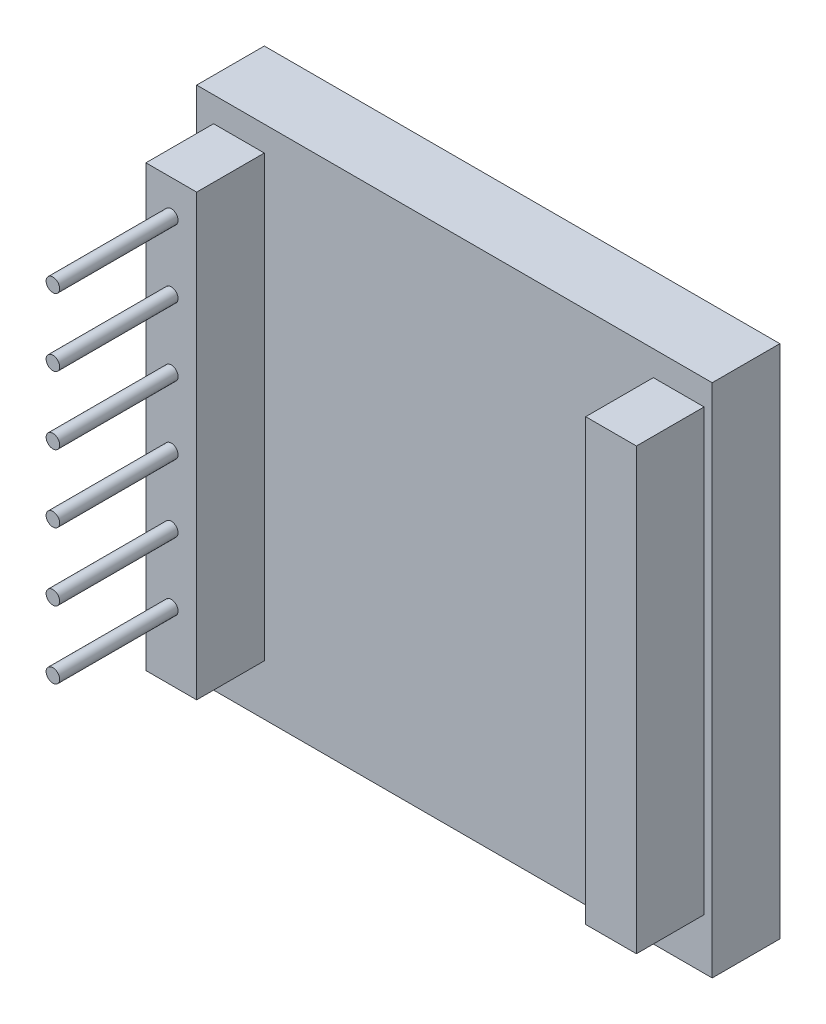
ISO-10303-21;
HEADER;
FILE_DESCRIPTION(('STEP AP214'),'2;1');
FILE_NAME('part.step','',(''),(''),'','','');
FILE_SCHEMA(('AUTOMOTIVE_DESIGN { 1 0 10303 214 1 1 1 1 }'));
ENDSEC;
DATA;
#1=APPLICATION_CONTEXT('core data for automotive mechanical design processes');
#2=APPLICATION_PROTOCOL_DEFINITION('international standard','automotive_design',2000,#1);
#3=PRODUCT_CONTEXT('',#1,'mechanical');
#4=PRODUCT('Part','Part','',(#3));
#5=PRODUCT_RELATED_PRODUCT_CATEGORY('part','',(#4));
#6=PRODUCT_DEFINITION_FORMATION('','',#4);
#7=PRODUCT_DEFINITION_CONTEXT('part definition',#1,'design');
#8=PRODUCT_DEFINITION('design','',#6,#7);
#9=PRODUCT_DEFINITION_SHAPE('','',#8);
#10=(LENGTH_UNIT() NAMED_UNIT(*) SI_UNIT(.MILLI.,.METRE.));
#11=(NAMED_UNIT(*) PLANE_ANGLE_UNIT() SI_UNIT($,.RADIAN.));
#12=(NAMED_UNIT(*) SI_UNIT($,.STERADIAN.) SOLID_ANGLE_UNIT());
#13=UNCERTAINTY_MEASURE_WITH_UNIT(LENGTH_MEASURE(1.E-05),#10,'distance_accuracy_value','');
#14=(GEOMETRIC_REPRESENTATION_CONTEXT(3) GLOBAL_UNCERTAINTY_ASSIGNED_CONTEXT((#13)) GLOBAL_UNIT_ASSIGNED_CONTEXT((#10,
#11,#12)) REPRESENTATION_CONTEXT('',''));
#15=CARTESIAN_POINT('',(0.,0.,0.));
#16=DIRECTION('',(0.,0.,1.));
#17=DIRECTION('',(1.,0.,0.));
#18=AXIS2_PLACEMENT_3D('',#15,#16,#17);
#19=CARTESIAN_POINT('',(0.,0.,2.));
#20=DIRECTION('',(0.,0.,-1.));
#21=DIRECTION('',(-1.,0.,0.));
#22=AXIS2_PLACEMENT_3D('',#19,#20,#21);
#23=PLANE('',#22);
#24=DIRECTION('',(0.,-1.,0.));
#25=VECTOR('',#24,1.);
#26=CARTESIAN_POINT('',(13.5,14.5,2.));
#27=LINE('',#26,#25);
#28=CARTESIAN_POINT('',(13.5,14.5,2.));
#29=VERTEX_POINT('',#28);
#30=CARTESIAN_POINT('',(13.5,1.5,2.));
#31=VERTEX_POINT('',#30);
#32=EDGE_CURVE('E146',#29,#31,#27,.T.);
#33=ORIENTED_EDGE('',*,*,#32,.F.);
#34=DIRECTION('',(-1.,0.,0.));
#35=VECTOR('',#34,1.);
#36=CARTESIAN_POINT('',(13.5,14.5,2.));
#37=LINE('',#36,#35);
#38=CARTESIAN_POINT('',(15.,14.5,2.));
#39=VERTEX_POINT('',#38);
#40=EDGE_CURVE('E159',#39,#29,#37,.T.);
#41=ORIENTED_EDGE('',*,*,#40,.F.);
#42=DIRECTION('',(0.,1.,0.));
#43=VECTOR('',#42,1.);
#44=CARTESIAN_POINT('',(15.,14.5,2.));
#45=LINE('',#44,#43);
#46=CARTESIAN_POINT('',(15.,1.5,2.));
#47=VERTEX_POINT('',#46);
#48=EDGE_CURVE('E168',#47,#39,#45,.T.);
#49=ORIENTED_EDGE('',*,*,#48,.F.);
#50=DIRECTION('',(1.,0.,0.));
#51=VECTOR('',#50,1.);
#52=CARTESIAN_POINT('',(13.5,1.5,2.));
#53=LINE('',#52,#51);
#54=EDGE_CURVE('E149',#31,#47,#53,.T.);
#55=ORIENTED_EDGE('',*,*,#54,.F.);
#56=EDGE_LOOP('',(#33,#41,#49,#55));
#57=FACE_BOUND('',#56,.T.);
#58=DIRECTION('',(0.,-1.,0.));
#59=VECTOR('',#58,1.);
#60=CARTESIAN_POINT('',(0.,0.,2.));
#61=LINE('',#60,#59);
#62=CARTESIAN_POINT('',(0.,15.24,2.));
#63=VERTEX_POINT('',#62);
#64=CARTESIAN_POINT('',(0.,0.,2.));
#65=VERTEX_POINT('',#64);
#66=EDGE_CURVE('E185',#63,#65,#61,.T.);
#67=ORIENTED_EDGE('',*,*,#66,.T.);
#68=DIRECTION('',(1.,0.,0.));
#69=VECTOR('',#68,1.);
#70=CARTESIAN_POINT('',(0.,0.,2.));
#71=LINE('',#70,#69);
#72=CARTESIAN_POINT('',(15.24,0.,2.));
#73=VERTEX_POINT('',#72);
#74=EDGE_CURVE('E188',#65,#73,#71,.T.);
#75=ORIENTED_EDGE('',*,*,#74,.T.);
#76=DIRECTION('',(0.,1.,0.));
#77=VECTOR('',#76,1.);
#78=CARTESIAN_POINT('',(15.24,0.,2.));
#79=LINE('',#78,#77);
#80=CARTESIAN_POINT('',(15.24,15.24,2.));
#81=VERTEX_POINT('',#80);
#82=EDGE_CURVE('E191',#73,#81,#79,.T.);
#83=ORIENTED_EDGE('',*,*,#82,.T.);
#84=DIRECTION('',(-1.,0.,0.));
#85=VECTOR('',#84,1.);
#86=CARTESIAN_POINT('',(0.,15.24,2.));
#87=LINE('',#86,#85);
#88=EDGE_CURVE('E193',#81,#63,#87,.T.);
#89=ORIENTED_EDGE('',*,*,#88,.T.);
#90=EDGE_LOOP('',(#67,#75,#83,#89));
#91=FACE_BOUND('',#90,.T.);
#92=DIRECTION('',(0.,-1.,0.));
#93=VECTOR('',#92,1.);
#94=CARTESIAN_POINT('',(0.5,14.5,2.));
#95=LINE('',#94,#93);
#96=CARTESIAN_POINT('',(0.5,14.5,2.));
#97=VERTEX_POINT('',#96);
#98=CARTESIAN_POINT('',(0.500000000000001,1.5,2.));
#99=VERTEX_POINT('',#98);
#100=EDGE_CURVE('E145',#97,#99,#95,.T.);
#101=ORIENTED_EDGE('',*,*,#100,.F.);
#102=DIRECTION('',(-1.,0.,0.));
#103=VECTOR('',#102,1.);
#104=CARTESIAN_POINT('',(0.5,14.5,2.));
#105=LINE('',#104,#103);
#106=CARTESIAN_POINT('',(2.,14.5,2.));
#107=VERTEX_POINT('',#106);
#108=EDGE_CURVE('E142',#107,#97,#105,.T.);
#109=ORIENTED_EDGE('',*,*,#108,.F.);
#110=DIRECTION('',(0.,1.,0.));
#111=VECTOR('',#110,1.);
#112=CARTESIAN_POINT('',(2.,14.5,2.));
#113=LINE('',#112,#111);
#114=CARTESIAN_POINT('',(2.,1.5,2.));
#115=VERTEX_POINT('',#114);
#116=EDGE_CURVE('E56',#115,#107,#113,.T.);
#117=ORIENTED_EDGE('',*,*,#116,.F.);
#118=DIRECTION('',(1.,0.,0.));
#119=VECTOR('',#118,1.);
#120=CARTESIAN_POINT('',(0.500000000000001,1.5,2.));
#121=LINE('',#120,#119);
#122=EDGE_CURVE('E51',#99,#115,#121,.T.);
#123=ORIENTED_EDGE('',*,*,#122,.F.);
#124=EDGE_LOOP('',(#101,#109,#117,#123));
#125=FACE_BOUND('',#124,.T.);
#126=ADVANCED_FACE('F35',(#57,#91,#125),#23,.F.);
#127=CARTESIAN_POINT('',(0.,0.,2.));
#128=DIRECTION('',(1.,0.,0.));
#129=DIRECTION('',(0.,0.,-1.));
#130=AXIS2_PLACEMENT_3D('',#127,#128,#129);
#131=PLANE('',#130);
#132=DIRECTION('',(0.,-1.,0.));
#133=VECTOR('',#132,1.);
#134=CARTESIAN_POINT('',(0.,0.,0.));
#135=LINE('',#134,#133);
#136=CARTESIAN_POINT('',(0.,15.24,0.));
#137=VERTEX_POINT('',#136);
#138=CARTESIAN_POINT('',(0.,0.,0.));
#139=VERTEX_POINT('',#138);
#140=EDGE_CURVE('E184',#137,#139,#135,.T.);
#141=ORIENTED_EDGE('',*,*,#140,.T.);
#142=DIRECTION('',(0.,0.,-1.));
#143=VECTOR('',#142,1.);
#144=CARTESIAN_POINT('',(0.,0.,2.));
#145=LINE('',#144,#143);
#146=EDGE_CURVE('E211',#65,#139,#145,.T.);
#147=ORIENTED_EDGE('',*,*,#146,.F.);
#148=ORIENTED_EDGE('',*,*,#66,.F.);
#149=DIRECTION('',(0.,0.,-1.));
#150=VECTOR('',#149,1.);
#151=CARTESIAN_POINT('',(0.,15.24,2.));
#152=LINE('',#151,#150);
#153=EDGE_CURVE('E195',#63,#137,#152,.T.);
#154=ORIENTED_EDGE('',*,*,#153,.T.);
#155=EDGE_LOOP('',(#141,#147,#148,#154));
#156=FACE_BOUND('',#155,.T.);
#157=ADVANCED_FACE('F37',(#156),#131,.F.);
#158=CARTESIAN_POINT('',(0.,0.,2.));
#159=DIRECTION('',(0.,1.,0.));
#160=DIRECTION('',(0.,0.,1.));
#161=AXIS2_PLACEMENT_3D('',#158,#159,#160);
#162=PLANE('',#161);
#163=DIRECTION('',(1.,0.,0.));
#164=VECTOR('',#163,1.);
#165=CARTESIAN_POINT('',(0.,0.,0.));
#166=LINE('',#165,#164);
#167=CARTESIAN_POINT('',(15.24,0.,0.));
#168=VERTEX_POINT('',#167);
#169=EDGE_CURVE('E198',#139,#168,#166,.T.);
#170=ORIENTED_EDGE('',*,*,#169,.T.);
#171=DIRECTION('',(0.,0.,-1.));
#172=VECTOR('',#171,1.);
#173=CARTESIAN_POINT('',(15.24,0.,2.));
#174=LINE('',#173,#172);
#175=EDGE_CURVE('E208',#73,#168,#174,.T.);
#176=ORIENTED_EDGE('',*,*,#175,.F.);
#177=ORIENTED_EDGE('',*,*,#74,.F.);
#178=ORIENTED_EDGE('',*,*,#146,.T.);
#179=EDGE_LOOP('',(#170,#176,#177,#178));
#180=FACE_BOUND('',#179,.T.);
#181=ADVANCED_FACE('F296',(#180),#162,.F.);
#182=CARTESIAN_POINT('',(15.24,0.,2.));
#183=DIRECTION('',(-1.,0.,0.));
#184=DIRECTION('',(0.,0.,1.));
#185=AXIS2_PLACEMENT_3D('',#182,#183,#184);
#186=PLANE('',#185);
#187=DIRECTION('',(0.,1.,0.));
#188=VECTOR('',#187,1.);
#189=CARTESIAN_POINT('',(15.24,0.,0.));
#190=LINE('',#189,#188);
#191=CARTESIAN_POINT('',(15.24,15.24,0.));
#192=VERTEX_POINT('',#191);
#193=EDGE_CURVE('E200',#168,#192,#190,.T.);
#194=ORIENTED_EDGE('',*,*,#193,.T.);
#195=DIRECTION('',(0.,0.,-1.));
#196=VECTOR('',#195,1.);
#197=CARTESIAN_POINT('',(15.24,15.24,2.));
#198=LINE('',#197,#196);
#199=EDGE_CURVE('E205',#81,#192,#198,.T.);
#200=ORIENTED_EDGE('',*,*,#199,.F.);
#201=ORIENTED_EDGE('',*,*,#82,.F.);
#202=ORIENTED_EDGE('',*,*,#175,.T.);
#203=EDGE_LOOP('',(#194,#200,#201,#202));
#204=FACE_BOUND('',#203,.T.);
#205=ADVANCED_FACE('F310',(#204),#186,.F.);
#206=CARTESIAN_POINT('',(0.,15.24,2.));
#207=DIRECTION('',(0.,-1.,0.));
#208=DIRECTION('',(0.,0.,-1.));
#209=AXIS2_PLACEMENT_3D('',#206,#207,#208);
#210=PLANE('',#209);
#211=DIRECTION('',(-1.,0.,0.));
#212=VECTOR('',#211,1.);
#213=CARTESIAN_POINT('',(0.,15.24,0.));
#214=LINE('',#213,#212);
#215=EDGE_CURVE('E189',#192,#137,#214,.T.);
#216=ORIENTED_EDGE('',*,*,#215,.T.);
#217=ORIENTED_EDGE('',*,*,#153,.F.);
#218=ORIENTED_EDGE('',*,*,#88,.F.);
#219=ORIENTED_EDGE('',*,*,#199,.T.);
#220=EDGE_LOOP('',(#216,#217,#218,#219));
#221=FACE_BOUND('',#220,.T.);
#222=ADVANCED_FACE('F306',(#221),#210,.F.);
#223=CARTESIAN_POINT('',(0.,0.,0.));
#224=DIRECTION('',(0.,0.,-1.));
#225=DIRECTION('',(-1.,0.,0.));
#226=AXIS2_PLACEMENT_3D('',#223,#224,#225);
#227=PLANE('',#226);
#228=CARTESIAN_POINT('',(1.2500000000001,3.5,0.));
#229=DIRECTION('',(0.,0.,-1.));
#230=DIRECTION('',(-1.,0.,0.));
#231=AXIS2_PLACEMENT_3D('',#228,#229,#230);
#232=CIRCLE('',#231,0.2);
#233=CARTESIAN_POINT('',(1.0500000000001,3.5,0.));
#234=VERTEX_POINT('',#233);
#235=EDGE_CURVE('E11',#234,#234,#232,.T.);
#236=ORIENTED_EDGE('',*,*,#235,.F.);
#237=EDGE_LOOP('',(#236));
#238=FACE_BOUND('',#237,.T.);
#239=CARTESIAN_POINT('',(1.25000000000008,5.5,0.));
#240=DIRECTION('',(0.,0.,-1.));
#241=DIRECTION('',(-1.,0.,0.));
#242=AXIS2_PLACEMENT_3D('',#239,#240,#241);
#243=CIRCLE('',#242,0.2);
#244=CARTESIAN_POINT('',(1.05000000000008,5.5,0.));
#245=VERTEX_POINT('',#244);
#246=EDGE_CURVE('E231',#245,#245,#243,.T.);
#247=ORIENTED_EDGE('',*,*,#246,.F.);
#248=EDGE_LOOP('',(#247));
#249=FACE_BOUND('',#248,.T.);
#250=CARTESIAN_POINT('',(1.25000000000006,7.5,0.));
#251=DIRECTION('',(0.,0.,-1.));
#252=DIRECTION('',(-1.,0.,0.));
#253=AXIS2_PLACEMENT_3D('',#250,#251,#252);
#254=CIRCLE('',#253,0.2);
#255=CARTESIAN_POINT('',(1.05000000000006,7.5,0.));
#256=VERTEX_POINT('',#255);
#257=EDGE_CURVE('E228',#256,#256,#254,.T.);
#258=ORIENTED_EDGE('',*,*,#257,.F.);
#259=EDGE_LOOP('',(#258));
#260=FACE_BOUND('',#259,.T.);
#261=CARTESIAN_POINT('',(1.25000000000004,9.5,0.));
#262=DIRECTION('',(0.,0.,-1.));
#263=DIRECTION('',(-1.,0.,0.));
#264=AXIS2_PLACEMENT_3D('',#261,#262,#263);
#265=CIRCLE('',#264,0.2);
#266=CARTESIAN_POINT('',(1.05000000000004,9.5,0.));
#267=VERTEX_POINT('',#266);
#268=EDGE_CURVE('E225',#267,#267,#265,.T.);
#269=ORIENTED_EDGE('',*,*,#268,.F.);
#270=EDGE_LOOP('',(#269));
#271=FACE_BOUND('',#270,.T.);
#272=CARTESIAN_POINT('',(1.25000000000002,11.5,0.));
#273=DIRECTION('',(0.,0.,-1.));
#274=DIRECTION('',(-1.,0.,0.));
#275=AXIS2_PLACEMENT_3D('',#272,#273,#274);
#276=CIRCLE('',#275,0.2);
#277=CARTESIAN_POINT('',(1.05000000000002,11.5,0.));
#278=VERTEX_POINT('',#277);
#279=EDGE_CURVE('E221',#278,#278,#276,.T.);
#280=ORIENTED_EDGE('',*,*,#279,.F.);
#281=EDGE_LOOP('',(#280));
#282=FACE_BOUND('',#281,.T.);
#283=CARTESIAN_POINT('',(1.25,13.5,0.));
#284=DIRECTION('',(0.,0.,-1.));
#285=DIRECTION('',(-1.,0.,0.));
#286=AXIS2_PLACEMENT_3D('',#283,#284,#285);
#287=CIRCLE('',#286,0.2);
#288=CARTESIAN_POINT('',(1.05,13.5,0.));
#289=VERTEX_POINT('',#288);
#290=EDGE_CURVE('E217',#289,#289,#287,.T.);
#291=ORIENTED_EDGE('',*,*,#290,.F.);
#292=EDGE_LOOP('',(#291));
#293=FACE_BOUND('',#292,.T.);
#294=ORIENTED_EDGE('',*,*,#140,.F.);
#295=ORIENTED_EDGE('',*,*,#215,.F.);
#296=ORIENTED_EDGE('',*,*,#193,.F.);
#297=ORIENTED_EDGE('',*,*,#169,.F.);
#298=EDGE_LOOP('',(#294,#295,#296,#297));
#299=FACE_BOUND('',#298,.T.);
#300=ADVANCED_FACE('F303',(#238,#249,#260,#271,#282,#293,#299),#227,.T.);
#301=CARTESIAN_POINT('',(13.5,14.5,4.));
#302=DIRECTION('',(1.,0.,0.));
#303=DIRECTION('',(0.,1.,0.));
#304=AXIS2_PLACEMENT_3D('',#301,#302,#303);
#305=PLANE('',#304);
#306=ORIENTED_EDGE('',*,*,#32,.T.);
#307=DIRECTION('',(0.,0.,-1.));
#308=VECTOR('',#307,1.);
#309=CARTESIAN_POINT('',(13.5,1.5,4.));
#310=LINE('',#309,#308);
#311=CARTESIAN_POINT('',(13.5,1.5,4.));
#312=VERTEX_POINT('',#311);
#313=EDGE_CURVE('E181',#312,#31,#310,.T.);
#314=ORIENTED_EDGE('',*,*,#313,.F.);
#315=DIRECTION('',(0.,-1.,0.));
#316=VECTOR('',#315,1.);
#317=CARTESIAN_POINT('',(13.5,14.5,4.));
#318=LINE('',#317,#316);
#319=CARTESIAN_POINT('',(13.5,14.5,4.));
#320=VERTEX_POINT('',#319);
#321=EDGE_CURVE('E155',#320,#312,#318,.T.);
#322=ORIENTED_EDGE('',*,*,#321,.F.);
#323=DIRECTION('',(0.,0.,-1.));
#324=VECTOR('',#323,1.);
#325=CARTESIAN_POINT('',(13.5,14.5,4.));
#326=LINE('',#325,#324);
#327=EDGE_CURVE('E164',#320,#29,#326,.T.);
#328=ORIENTED_EDGE('',*,*,#327,.T.);
#329=EDGE_LOOP('',(#306,#314,#322,#328));
#330=FACE_BOUND('',#329,.T.);
#331=ADVANCED_FACE('F301',(#330),#305,.F.);
#332=CARTESIAN_POINT('',(13.5,1.5,4.));
#333=DIRECTION('',(0.,1.,0.));
#334=DIRECTION('',(0.,0.,1.));
#335=AXIS2_PLACEMENT_3D('',#332,#333,#334);
#336=PLANE('',#335);
#337=ORIENTED_EDGE('',*,*,#54,.T.);
#338=DIRECTION('',(0.,0.,-1.));
#339=VECTOR('',#338,1.);
#340=CARTESIAN_POINT('',(15.,1.5,4.));
#341=LINE('',#340,#339);
#342=CARTESIAN_POINT('',(15.,1.5,4.));
#343=VERTEX_POINT('',#342);
#344=EDGE_CURVE('E178',#343,#47,#341,.T.);
#345=ORIENTED_EDGE('',*,*,#344,.F.);
#346=DIRECTION('',(1.,0.,0.));
#347=VECTOR('',#346,1.);
#348=CARTESIAN_POINT('',(13.5,1.5,4.));
#349=LINE('',#348,#347);
#350=EDGE_CURVE('E158',#312,#343,#349,.T.);
#351=ORIENTED_EDGE('',*,*,#350,.F.);
#352=ORIENTED_EDGE('',*,*,#313,.T.);
#353=EDGE_LOOP('',(#337,#345,#351,#352));
#354=FACE_BOUND('',#353,.T.);
#355=ADVANCED_FACE('F351',(#354),#336,.F.);
#356=CARTESIAN_POINT('',(15.,14.5,4.));
#357=DIRECTION('',(-1.,0.,0.));
#358=DIRECTION('',(0.,-1.,0.));
#359=AXIS2_PLACEMENT_3D('',#356,#357,#358);
#360=PLANE('',#359);
#361=ORIENTED_EDGE('',*,*,#48,.T.);
#362=DIRECTION('',(0.,0.,-1.));
#363=VECTOR('',#362,1.);
#364=CARTESIAN_POINT('',(15.,14.5,4.));
#365=LINE('',#364,#363);
#366=CARTESIAN_POINT('',(15.,14.5,4.));
#367=VERTEX_POINT('',#366);
#368=EDGE_CURVE('E175',#367,#39,#365,.T.);
#369=ORIENTED_EDGE('',*,*,#368,.F.);
#370=DIRECTION('',(0.,1.,0.));
#371=VECTOR('',#370,1.);
#372=CARTESIAN_POINT('',(15.,14.5,4.));
#373=LINE('',#372,#371);
#374=EDGE_CURVE('E161',#343,#367,#373,.T.);
#375=ORIENTED_EDGE('',*,*,#374,.F.);
#376=ORIENTED_EDGE('',*,*,#344,.T.);
#377=EDGE_LOOP('',(#361,#369,#375,#376));
#378=FACE_BOUND('',#377,.T.);
#379=ADVANCED_FACE('F358',(#378),#360,.F.);
#380=CARTESIAN_POINT('',(13.5,14.5,4.));
#381=DIRECTION('',(0.,-1.,0.));
#382=DIRECTION('',(0.,0.,-1.));
#383=AXIS2_PLACEMENT_3D('',#380,#381,#382);
#384=PLANE('',#383);
#385=ORIENTED_EDGE('',*,*,#40,.T.);
#386=ORIENTED_EDGE('',*,*,#327,.F.);
#387=DIRECTION('',(-1.,0.,0.));
#388=VECTOR('',#387,1.);
#389=CARTESIAN_POINT('',(13.5,14.5,4.));
#390=LINE('',#389,#388);
#391=EDGE_CURVE('E163',#367,#320,#390,.T.);
#392=ORIENTED_EDGE('',*,*,#391,.F.);
#393=ORIENTED_EDGE('',*,*,#368,.T.);
#394=EDGE_LOOP('',(#385,#386,#392,#393));
#395=FACE_BOUND('',#394,.T.);
#396=ADVANCED_FACE('F365',(#395),#384,.F.);
#397=CARTESIAN_POINT('',(0.,0.,4.));
#398=DIRECTION('',(0.,0.,1.));
#399=DIRECTION('',(1.,0.,0.));
#400=AXIS2_PLACEMENT_3D('',#397,#398,#399);
#401=PLANE('',#400);
#402=ORIENTED_EDGE('',*,*,#321,.T.);
#403=ORIENTED_EDGE('',*,*,#350,.T.);
#404=ORIENTED_EDGE('',*,*,#374,.T.);
#405=ORIENTED_EDGE('',*,*,#391,.T.);
#406=EDGE_LOOP('',(#402,#403,#404,#405));
#407=FACE_BOUND('',#406,.T.);
#408=ADVANCED_FACE('F373',(#407),#401,.T.);
#409=CARTESIAN_POINT('',(0.5,14.5,4.));
#410=DIRECTION('',(1.,0.,0.));
#411=DIRECTION('',(0.,1.,0.));
#412=AXIS2_PLACEMENT_3D('',#409,#410,#411);
#413=PLANE('',#412);
#414=ORIENTED_EDGE('',*,*,#100,.T.);
#415=DIRECTION('',(0.,0.,-1.));
#416=VECTOR('',#415,1.);
#417=CARTESIAN_POINT('',(0.500000000000001,1.5,4.));
#418=LINE('',#417,#416);
#419=CARTESIAN_POINT('',(0.500000000000001,1.5,4.));
#420=VERTEX_POINT('',#419);
#421=EDGE_CURVE('E126',#420,#99,#418,.T.);
#422=ORIENTED_EDGE('',*,*,#421,.F.);
#423=DIRECTION('',(0.,-1.,0.));
#424=VECTOR('',#423,1.);
#425=CARTESIAN_POINT('',(0.5,14.5,4.));
#426=LINE('',#425,#424);
#427=CARTESIAN_POINT('',(0.5,14.5,4.));
#428=VERTEX_POINT('',#427);
#429=EDGE_CURVE('E133',#428,#420,#426,.T.);
#430=ORIENTED_EDGE('',*,*,#429,.F.);
#431=DIRECTION('',(0.,0.,-1.));
#432=VECTOR('',#431,1.);
#433=CARTESIAN_POINT('',(0.5,14.5,4.));
#434=LINE('',#433,#432);
#435=EDGE_CURVE('E270',#428,#97,#434,.T.);
#436=ORIENTED_EDGE('',*,*,#435,.T.);
#437=EDGE_LOOP('',(#414,#422,#430,#436));
#438=FACE_BOUND('',#437,.T.);
#439=ADVANCED_FACE('F144',(#438),#413,.F.);
#440=CARTESIAN_POINT('',(0.500000000000001,1.5,4.));
#441=DIRECTION('',(0.,1.,0.));
#442=DIRECTION('',(0.,0.,1.));
#443=AXIS2_PLACEMENT_3D('',#440,#441,#442);
#444=PLANE('',#443);
#445=ORIENTED_EDGE('',*,*,#122,.T.);
#446=DIRECTION('',(0.,0.,-1.));
#447=VECTOR('',#446,1.);
#448=CARTESIAN_POINT('',(2.,1.5,4.));
#449=LINE('',#448,#447);
#450=CARTESIAN_POINT('',(2.,1.5,4.));
#451=VERTEX_POINT('',#450);
#452=EDGE_CURVE('E129',#451,#115,#449,.T.);
#453=ORIENTED_EDGE('',*,*,#452,.F.);
#454=DIRECTION('',(1.,0.,0.));
#455=VECTOR('',#454,1.);
#456=CARTESIAN_POINT('',(0.500000000000001,1.5,4.));
#457=LINE('',#456,#455);
#458=EDGE_CURVE('E122',#420,#451,#457,.T.);
#459=ORIENTED_EDGE('',*,*,#458,.F.);
#460=ORIENTED_EDGE('',*,*,#421,.T.);
#461=EDGE_LOOP('',(#445,#453,#459,#460));
#462=FACE_BOUND('',#461,.T.);
#463=ADVANCED_FACE('F124',(#462),#444,.F.);
#464=CARTESIAN_POINT('',(2.,14.5,4.));
#465=DIRECTION('',(-1.,0.,0.));
#466=DIRECTION('',(0.,-1.,0.));
#467=AXIS2_PLACEMENT_3D('',#464,#465,#466);
#468=PLANE('',#467);
#469=ORIENTED_EDGE('',*,*,#116,.T.);
#470=DIRECTION('',(0.,0.,-1.));
#471=VECTOR('',#470,1.);
#472=CARTESIAN_POINT('',(2.,14.5,4.));
#473=LINE('',#472,#471);
#474=CARTESIAN_POINT('',(2.,14.5,4.));
#475=VERTEX_POINT('',#474);
#476=EDGE_CURVE('E151',#475,#107,#473,.T.);
#477=ORIENTED_EDGE('',*,*,#476,.F.);
#478=DIRECTION('',(0.,1.,0.));
#479=VECTOR('',#478,1.);
#480=CARTESIAN_POINT('',(2.,14.5,4.));
#481=LINE('',#480,#479);
#482=EDGE_CURVE('E132',#451,#475,#481,.T.);
#483=ORIENTED_EDGE('',*,*,#482,.F.);
#484=ORIENTED_EDGE('',*,*,#452,.T.);
#485=EDGE_LOOP('',(#469,#477,#483,#484));
#486=FACE_BOUND('',#485,.T.);
#487=ADVANCED_FACE('F281',(#486),#468,.F.);
#488=CARTESIAN_POINT('',(0.5,14.5,4.));
#489=DIRECTION('',(0.,-1.,0.));
#490=DIRECTION('',(0.,0.,-1.));
#491=AXIS2_PLACEMENT_3D('',#488,#489,#490);
#492=PLANE('',#491);
#493=ORIENTED_EDGE('',*,*,#108,.T.);
#494=ORIENTED_EDGE('',*,*,#435,.F.);
#495=DIRECTION('',(-1.,0.,0.));
#496=VECTOR('',#495,1.);
#497=CARTESIAN_POINT('',(0.5,14.5,4.));
#498=LINE('',#497,#496);
#499=EDGE_CURVE('E138',#475,#428,#498,.T.);
#500=ORIENTED_EDGE('',*,*,#499,.F.);
#501=ORIENTED_EDGE('',*,*,#476,.T.);
#502=EDGE_LOOP('',(#493,#494,#500,#501));
#503=FACE_BOUND('',#502,.T.);
#504=ADVANCED_FACE('F279',(#503),#492,.F.);
#505=CARTESIAN_POINT('',(0.,0.,4.));
#506=DIRECTION('',(0.,0.,1.));
#507=DIRECTION('',(1.,0.,0.));
#508=AXIS2_PLACEMENT_3D('',#505,#506,#507);
#509=PLANE('',#508);
#510=CARTESIAN_POINT('',(1.2500000000001,3.5,4.));
#511=DIRECTION('',(0.,0.,1.));
#512=DIRECTION('',(1.,0.,0.));
#513=AXIS2_PLACEMENT_3D('',#510,#511,#512);
#514=CIRCLE('',#513,0.2);
#515=CARTESIAN_POINT('',(1.4500000000001,3.5,4.));
#516=VERTEX_POINT('',#515);
#517=EDGE_CURVE('E39',#516,#516,#514,.T.);
#518=ORIENTED_EDGE('',*,*,#517,.F.);
#519=EDGE_LOOP('',(#518));
#520=FACE_BOUND('',#519,.T.);
#521=CARTESIAN_POINT('',(1.25000000000008,5.5,4.));
#522=DIRECTION('',(0.,0.,1.));
#523=DIRECTION('',(1.,0.,0.));
#524=AXIS2_PLACEMENT_3D('',#521,#522,#523);
#525=CIRCLE('',#524,0.2);
#526=CARTESIAN_POINT('',(1.45000000000008,5.5,4.));
#527=VERTEX_POINT('',#526);
#528=EDGE_CURVE('E229',#527,#527,#525,.T.);
#529=ORIENTED_EDGE('',*,*,#528,.F.);
#530=EDGE_LOOP('',(#529));
#531=FACE_BOUND('',#530,.T.);
#532=CARTESIAN_POINT('',(1.25000000000006,7.5,4.));
#533=DIRECTION('',(0.,0.,1.));
#534=DIRECTION('',(1.,0.,0.));
#535=AXIS2_PLACEMENT_3D('',#532,#533,#534);
#536=CIRCLE('',#535,0.2);
#537=CARTESIAN_POINT('',(1.45000000000006,7.5,4.));
#538=VERTEX_POINT('',#537);
#539=EDGE_CURVE('E226',#538,#538,#536,.T.);
#540=ORIENTED_EDGE('',*,*,#539,.F.);
#541=EDGE_LOOP('',(#540));
#542=FACE_BOUND('',#541,.T.);
#543=CARTESIAN_POINT('',(1.25000000000004,9.5,4.));
#544=DIRECTION('',(0.,0.,1.));
#545=DIRECTION('',(1.,0.,0.));
#546=AXIS2_PLACEMENT_3D('',#543,#544,#545);
#547=CIRCLE('',#546,0.2);
#548=CARTESIAN_POINT('',(1.45000000000004,9.5,4.));
#549=VERTEX_POINT('',#548);
#550=EDGE_CURVE('E222',#549,#549,#547,.T.);
#551=ORIENTED_EDGE('',*,*,#550,.F.);
#552=EDGE_LOOP('',(#551));
#553=FACE_BOUND('',#552,.T.);
#554=CARTESIAN_POINT('',(1.25000000000002,11.5,4.));
#555=DIRECTION('',(0.,0.,1.));
#556=DIRECTION('',(1.,0.,0.));
#557=AXIS2_PLACEMENT_3D('',#554,#555,#556);
#558=CIRCLE('',#557,0.2);
#559=CARTESIAN_POINT('',(1.45000000000002,11.5,4.));
#560=VERTEX_POINT('',#559);
#561=EDGE_CURVE('E218',#560,#560,#558,.T.);
#562=ORIENTED_EDGE('',*,*,#561,.F.);
#563=EDGE_LOOP('',(#562));
#564=FACE_BOUND('',#563,.T.);
#565=CARTESIAN_POINT('',(1.25,13.5,4.));
#566=DIRECTION('',(0.,0.,1.));
#567=DIRECTION('',(1.,0.,0.));
#568=AXIS2_PLACEMENT_3D('',#565,#566,#567);
#569=CIRCLE('',#568,0.2);
#570=CARTESIAN_POINT('',(1.45,13.5,4.));
#571=VERTEX_POINT('',#570);
#572=EDGE_CURVE('E214',#571,#571,#569,.T.);
#573=ORIENTED_EDGE('',*,*,#572,.F.);
#574=EDGE_LOOP('',(#573));
#575=FACE_BOUND('',#574,.T.);
#576=ORIENTED_EDGE('',*,*,#429,.T.);
#577=ORIENTED_EDGE('',*,*,#458,.T.);
#578=ORIENTED_EDGE('',*,*,#482,.T.);
#579=ORIENTED_EDGE('',*,*,#499,.T.);
#580=EDGE_LOOP('',(#576,#577,#578,#579));
#581=FACE_BOUND('',#580,.T.);
#582=ADVANCED_FACE('F136',(#520,#531,#542,#553,#564,#575,#581),#509,.T.);
#583=CARTESIAN_POINT('',(1.25,13.5,7.5));
#584=DIRECTION('',(0.,0.,1.));
#585=DIRECTION('',(1.,0.,0.));
#586=AXIS2_PLACEMENT_3D('',#583,#584,#585);
#587=PLANE('',#586);
#588=CARTESIAN_POINT('',(1.25,13.5,7.5));
#589=DIRECTION('',(0.,0.,1.));
#590=DIRECTION('',(1.,0.,0.));
#591=AXIS2_PLACEMENT_3D('',#588,#589,#590);
#592=CIRCLE('',#591,0.2);
#593=CARTESIAN_POINT('',(1.45,13.5,7.5));
#594=VERTEX_POINT('',#593);
#595=EDGE_CURVE('E258',#594,#594,#592,.T.);
#596=ORIENTED_EDGE('',*,*,#595,.T.);
#597=EDGE_LOOP('',(#596));
#598=FACE_BOUND('',#597,.T.);
#599=ADVANCED_FACE('F409',(#598),#587,.T.);
#600=CARTESIAN_POINT('',(1.25,13.5,-0.5));
#601=DIRECTION('',(0.,0.,1.));
#602=DIRECTION('',(1.,0.,0.));
#603=AXIS2_PLACEMENT_3D('',#600,#601,#602);
#604=CYLINDRICAL_SURFACE('',#603,0.2);
#605=ORIENTED_EDGE('',*,*,#572,.T.);
#606=EDGE_LOOP('',(#605));
#607=FACE_BOUND('',#606,.T.);
#608=ORIENTED_EDGE('',*,*,#595,.F.);
#609=EDGE_LOOP('',(#608));
#610=FACE_BOUND('',#609,.T.);
#611=ADVANCED_FACE('F416',(#607,#610),#604,.T.);
#612=ORIENTED_EDGE('',*,*,#290,.T.);
#613=EDGE_LOOP('',(#612));
#614=FACE_BOUND('',#613,.T.);
#615=CARTESIAN_POINT('',(1.25,13.5,-0.5));
#616=DIRECTION('',(0.,0.,1.));
#617=DIRECTION('',(1.,0.,0.));
#618=AXIS2_PLACEMENT_3D('',#615,#616,#617);
#619=CIRCLE('',#618,0.2);
#620=CARTESIAN_POINT('',(1.45,13.5,-0.5));
#621=VERTEX_POINT('',#620);
#622=EDGE_CURVE('E263',#621,#621,#619,.T.);
#623=ORIENTED_EDGE('',*,*,#622,.T.);
#624=EDGE_LOOP('',(#623));
#625=FACE_BOUND('',#624,.T.);
#626=ADVANCED_FACE('F424',(#614,#625),#604,.T.);
#627=CARTESIAN_POINT('',(1.25,13.5,-0.5));
#628=DIRECTION('',(0.,0.,1.));
#629=DIRECTION('',(1.,0.,0.));
#630=AXIS2_PLACEMENT_3D('',#627,#628,#629);
#631=PLANE('',#630);
#632=ORIENTED_EDGE('',*,*,#622,.F.);
#633=EDGE_LOOP('',(#632));
#634=FACE_BOUND('',#633,.T.);
#635=ADVANCED_FACE('F432',(#634),#631,.F.);
#636=CARTESIAN_POINT('',(1.25000000000002,11.5,7.5));
#637=DIRECTION('',(0.,0.,1.));
#638=DIRECTION('',(1.,0.,0.));
#639=AXIS2_PLACEMENT_3D('',#636,#637,#638);
#640=PLANE('',#639);
#641=CARTESIAN_POINT('',(1.25000000000002,11.5,7.5));
#642=DIRECTION('',(0.,0.,1.));
#643=DIRECTION('',(1.,0.,0.));
#644=AXIS2_PLACEMENT_3D('',#641,#642,#643);
#645=CIRCLE('',#644,0.2);
#646=CARTESIAN_POINT('',(1.45000000000002,11.5,7.5));
#647=VERTEX_POINT('',#646);
#648=EDGE_CURVE('E250',#647,#647,#645,.T.);
#649=ORIENTED_EDGE('',*,*,#648,.T.);
#650=EDGE_LOOP('',(#649));
#651=FACE_BOUND('',#650,.T.);
#652=ADVANCED_FACE('F439',(#651),#640,.T.);
#653=CARTESIAN_POINT('',(1.25000000000002,11.5,-0.5));
#654=DIRECTION('',(0.,0.,1.));
#655=DIRECTION('',(1.,0.,0.));
#656=AXIS2_PLACEMENT_3D('',#653,#654,#655);
#657=CYLINDRICAL_SURFACE('',#656,0.2);
#658=ORIENTED_EDGE('',*,*,#561,.T.);
#659=EDGE_LOOP('',(#658));
#660=FACE_BOUND('',#659,.T.);
#661=ORIENTED_EDGE('',*,*,#648,.F.);
#662=EDGE_LOOP('',(#661));
#663=FACE_BOUND('',#662,.T.);
#664=ADVANCED_FACE('F447',(#660,#663),#657,.T.);
#665=ORIENTED_EDGE('',*,*,#279,.T.);
#666=EDGE_LOOP('',(#665));
#667=FACE_BOUND('',#666,.T.);
#668=CARTESIAN_POINT('',(1.25000000000002,11.5,-0.5));
#669=DIRECTION('',(0.,0.,1.));
#670=DIRECTION('',(1.,0.,0.));
#671=AXIS2_PLACEMENT_3D('',#668,#669,#670);
#672=CIRCLE('',#671,0.2);
#673=CARTESIAN_POINT('',(1.45000000000002,11.5,-0.5));
#674=VERTEX_POINT('',#673);
#675=EDGE_CURVE('E255',#674,#674,#672,.T.);
#676=ORIENTED_EDGE('',*,*,#675,.T.);
#677=EDGE_LOOP('',(#676));
#678=FACE_BOUND('',#677,.T.);
#679=ADVANCED_FACE('F455',(#667,#678),#657,.T.);
#680=CARTESIAN_POINT('',(1.25000000000002,11.5,-0.5));
#681=DIRECTION('',(0.,0.,1.));
#682=DIRECTION('',(1.,0.,0.));
#683=AXIS2_PLACEMENT_3D('',#680,#681,#682);
#684=PLANE('',#683);
#685=ORIENTED_EDGE('',*,*,#675,.F.);
#686=EDGE_LOOP('',(#685));
#687=FACE_BOUND('',#686,.T.);
#688=ADVANCED_FACE('F463',(#687),#684,.F.);
#689=CARTESIAN_POINT('',(1.25000000000004,9.5,7.5));
#690=DIRECTION('',(0.,0.,1.));
#691=DIRECTION('',(1.,0.,0.));
#692=AXIS2_PLACEMENT_3D('',#689,#690,#691);
#693=PLANE('',#692);
#694=CARTESIAN_POINT('',(1.25000000000004,9.5,7.5));
#695=DIRECTION('',(0.,0.,1.));
#696=DIRECTION('',(1.,0.,0.));
#697=AXIS2_PLACEMENT_3D('',#694,#695,#696);
#698=CIRCLE('',#697,0.2);
#699=CARTESIAN_POINT('',(1.45000000000004,9.5,7.5));
#700=VERTEX_POINT('',#699);
#701=EDGE_CURVE('E244',#700,#700,#698,.T.);
#702=ORIENTED_EDGE('',*,*,#701,.T.);
#703=EDGE_LOOP('',(#702));
#704=FACE_BOUND('',#703,.T.);
#705=ADVANCED_FACE('F470',(#704),#693,.T.);
#706=CARTESIAN_POINT('',(1.25000000000004,9.5,-0.5));
#707=DIRECTION('',(0.,0.,1.));
#708=DIRECTION('',(1.,0.,0.));
#709=AXIS2_PLACEMENT_3D('',#706,#707,#708);
#710=CYLINDRICAL_SURFACE('',#709,0.2);
#711=ORIENTED_EDGE('',*,*,#550,.T.);
#712=EDGE_LOOP('',(#711));
#713=FACE_BOUND('',#712,.T.);
#714=ORIENTED_EDGE('',*,*,#701,.F.);
#715=EDGE_LOOP('',(#714));
#716=FACE_BOUND('',#715,.T.);
#717=ADVANCED_FACE('F478',(#713,#716),#710,.T.);
#718=ORIENTED_EDGE('',*,*,#268,.T.);
#719=EDGE_LOOP('',(#718));
#720=FACE_BOUND('',#719,.T.);
#721=CARTESIAN_POINT('',(1.25000000000004,9.5,-0.5));
#722=DIRECTION('',(0.,0.,1.));
#723=DIRECTION('',(1.,0.,0.));
#724=AXIS2_PLACEMENT_3D('',#721,#722,#723);
#725=CIRCLE('',#724,0.2);
#726=CARTESIAN_POINT('',(1.45000000000004,9.5,-0.5));
#727=VERTEX_POINT('',#726);
#728=EDGE_CURVE('E247',#727,#727,#725,.T.);
#729=ORIENTED_EDGE('',*,*,#728,.T.);
#730=EDGE_LOOP('',(#729));
#731=FACE_BOUND('',#730,.T.);
#732=ADVANCED_FACE('F486',(#720,#731),#710,.T.);
#733=CARTESIAN_POINT('',(1.25000000000004,9.5,-0.5));
#734=DIRECTION('',(0.,0.,1.));
#735=DIRECTION('',(1.,0.,0.));
#736=AXIS2_PLACEMENT_3D('',#733,#734,#735);
#737=PLANE('',#736);
#738=ORIENTED_EDGE('',*,*,#728,.F.);
#739=EDGE_LOOP('',(#738));
#740=FACE_BOUND('',#739,.T.);
#741=ADVANCED_FACE('F494',(#740),#737,.F.);
#742=CARTESIAN_POINT('',(1.25000000000006,7.5,7.5));
#743=DIRECTION('',(0.,0.,1.));
#744=DIRECTION('',(1.,0.,0.));
#745=AXIS2_PLACEMENT_3D('',#742,#743,#744);
#746=PLANE('',#745);
#747=CARTESIAN_POINT('',(1.25000000000006,7.5,7.5));
#748=DIRECTION('',(0.,0.,1.));
#749=DIRECTION('',(1.,0.,0.));
#750=AXIS2_PLACEMENT_3D('',#747,#748,#749);
#751=CIRCLE('',#750,0.2);
#752=CARTESIAN_POINT('',(1.45000000000006,7.5,7.5));
#753=VERTEX_POINT('',#752);
#754=EDGE_CURVE('E659',#753,#753,#751,.T.);
#755=ORIENTED_EDGE('',*,*,#754,.T.);
#756=EDGE_LOOP('',(#755));
#757=FACE_BOUND('',#756,.T.);
#758=ADVANCED_FACE('F501',(#757),#746,.T.);
#759=CARTESIAN_POINT('',(1.25000000000006,7.5,-0.5));
#760=DIRECTION('',(0.,0.,1.));
#761=DIRECTION('',(1.,0.,0.));
#762=AXIS2_PLACEMENT_3D('',#759,#760,#761);
#763=CYLINDRICAL_SURFACE('',#762,0.2);
#764=ORIENTED_EDGE('',*,*,#539,.T.);
#765=EDGE_LOOP('',(#764));
#766=FACE_BOUND('',#765,.T.);
#767=ORIENTED_EDGE('',*,*,#754,.F.);
#768=EDGE_LOOP('',(#767));
#769=FACE_BOUND('',#768,.T.);
#770=ADVANCED_FACE('F509',(#766,#769),#763,.T.);
#771=ORIENTED_EDGE('',*,*,#257,.T.);
#772=EDGE_LOOP('',(#771));
#773=FACE_BOUND('',#772,.T.);
#774=CARTESIAN_POINT('',(1.25000000000006,7.5,-0.5));
#775=DIRECTION('',(0.,0.,1.));
#776=DIRECTION('',(1.,0.,0.));
#777=AXIS2_PLACEMENT_3D('',#774,#775,#776);
#778=CIRCLE('',#777,0.2);
#779=CARTESIAN_POINT('',(1.45000000000006,7.5,-0.5));
#780=VERTEX_POINT('',#779);
#781=EDGE_CURVE('E242',#780,#780,#778,.T.);
#782=ORIENTED_EDGE('',*,*,#781,.T.);
#783=EDGE_LOOP('',(#782));
#784=FACE_BOUND('',#783,.T.);
#785=ADVANCED_FACE('F517',(#773,#784),#763,.T.);
#786=CARTESIAN_POINT('',(1.25000000000006,7.5,-0.5));
#787=DIRECTION('',(0.,0.,1.));
#788=DIRECTION('',(1.,0.,0.));
#789=AXIS2_PLACEMENT_3D('',#786,#787,#788);
#790=PLANE('',#789);
#791=ORIENTED_EDGE('',*,*,#781,.F.);
#792=EDGE_LOOP('',(#791));
#793=FACE_BOUND('',#792,.T.);
#794=ADVANCED_FACE('F525',(#793),#790,.F.);
#795=CARTESIAN_POINT('',(1.25000000000008,5.5,7.5));
#796=DIRECTION('',(0.,0.,1.));
#797=DIRECTION('',(1.,0.,0.));
#798=AXIS2_PLACEMENT_3D('',#795,#796,#797);
#799=PLANE('',#798);
#800=CARTESIAN_POINT('',(1.25000000000008,5.5,7.5));
#801=DIRECTION('',(0.,0.,1.));
#802=DIRECTION('',(1.,0.,0.));
#803=AXIS2_PLACEMENT_3D('',#800,#801,#802);
#804=CIRCLE('',#803,0.2);
#805=CARTESIAN_POINT('',(1.45000000000008,5.5,7.5));
#806=VERTEX_POINT('',#805);
#807=EDGE_CURVE('E649',#806,#806,#804,.T.);
#808=ORIENTED_EDGE('',*,*,#807,.T.);
#809=EDGE_LOOP('',(#808));
#810=FACE_BOUND('',#809,.T.);
#811=ADVANCED_FACE('F531',(#810),#799,.T.);
#812=CARTESIAN_POINT('',(1.25000000000008,5.5,-0.5));
#813=DIRECTION('',(0.,0.,1.));
#814=DIRECTION('',(1.,0.,0.));
#815=AXIS2_PLACEMENT_3D('',#812,#813,#814);
#816=CYLINDRICAL_SURFACE('',#815,0.2);
#817=ORIENTED_EDGE('',*,*,#528,.T.);
#818=EDGE_LOOP('',(#817));
#819=FACE_BOUND('',#818,.T.);
#820=ORIENTED_EDGE('',*,*,#807,.F.);
#821=EDGE_LOOP('',(#820));
#822=FACE_BOUND('',#821,.T.);
#823=ADVANCED_FACE('F539',(#819,#822),#816,.T.);
#824=ORIENTED_EDGE('',*,*,#246,.T.);
#825=EDGE_LOOP('',(#824));
#826=FACE_BOUND('',#825,.T.);
#827=CARTESIAN_POINT('',(1.25000000000008,5.5,-0.5));
#828=DIRECTION('',(0.,0.,1.));
#829=DIRECTION('',(1.,0.,0.));
#830=AXIS2_PLACEMENT_3D('',#827,#828,#829);
#831=CIRCLE('',#830,0.2);
#832=CARTESIAN_POINT('',(1.45000000000008,5.5,-0.5));
#833=VERTEX_POINT('',#832);
#834=EDGE_CURVE('E653',#833,#833,#831,.T.);
#835=ORIENTED_EDGE('',*,*,#834,.T.);
#836=EDGE_LOOP('',(#835));
#837=FACE_BOUND('',#836,.T.);
#838=ADVANCED_FACE('F547',(#826,#837),#816,.T.);
#839=CARTESIAN_POINT('',(1.25000000000008,5.5,-0.5));
#840=DIRECTION('',(0.,0.,1.));
#841=DIRECTION('',(1.,0.,0.));
#842=AXIS2_PLACEMENT_3D('',#839,#840,#841);
#843=PLANE('',#842);
#844=ORIENTED_EDGE('',*,*,#834,.F.);
#845=EDGE_LOOP('',(#844));
#846=FACE_BOUND('',#845,.T.);
#847=ADVANCED_FACE('F554',(#846),#843,.F.);
#848=CARTESIAN_POINT('',(1.2500000000001,3.5,7.5));
#849=DIRECTION('',(0.,0.,1.));
#850=DIRECTION('',(1.,0.,0.));
#851=AXIS2_PLACEMENT_3D('',#848,#849,#850);
#852=PLANE('',#851);
#853=CARTESIAN_POINT('',(1.2500000000001,3.5,7.5));
#854=DIRECTION('',(0.,0.,1.));
#855=DIRECTION('',(1.,0.,0.));
#856=AXIS2_PLACEMENT_3D('',#853,#854,#855);
#857=CIRCLE('',#856,0.2);
#858=CARTESIAN_POINT('',(1.4500000000001,3.5,7.5));
#859=VERTEX_POINT('',#858);
#860=EDGE_CURVE('E650',#859,#859,#857,.T.);
#861=ORIENTED_EDGE('',*,*,#860,.T.);
#862=EDGE_LOOP('',(#861));
#863=FACE_BOUND('',#862,.T.);
#864=ADVANCED_FACE('F561',(#863),#852,.T.);
#865=CARTESIAN_POINT('',(1.2500000000001,3.5,-0.5));
#866=DIRECTION('',(0.,0.,1.));
#867=DIRECTION('',(1.,0.,0.));
#868=AXIS2_PLACEMENT_3D('',#865,#866,#867);
#869=CYLINDRICAL_SURFACE('',#868,0.2);
#870=ORIENTED_EDGE('',*,*,#517,.T.);
#871=EDGE_LOOP('',(#870));
#872=FACE_BOUND('',#871,.T.);
#873=ORIENTED_EDGE('',*,*,#860,.F.);
#874=EDGE_LOOP('',(#873));
#875=FACE_BOUND('',#874,.T.);
#876=ADVANCED_FACE('F569',(#872,#875),#869,.T.);
#877=ORIENTED_EDGE('',*,*,#235,.T.);
#878=EDGE_LOOP('',(#877));
#879=FACE_BOUND('',#878,.T.);
#880=CARTESIAN_POINT('',(1.2500000000001,3.5,-0.5));
#881=DIRECTION('',(0.,0.,1.));
#882=DIRECTION('',(1.,0.,0.));
#883=AXIS2_PLACEMENT_3D('',#880,#881,#882);
#884=CIRCLE('',#883,0.2);
#885=CARTESIAN_POINT('',(1.4500000000001,3.5,-0.5));
#886=VERTEX_POINT('',#885);
#887=EDGE_CURVE('E647',#886,#886,#884,.T.);
#888=ORIENTED_EDGE('',*,*,#887,.T.);
#889=EDGE_LOOP('',(#888));
#890=FACE_BOUND('',#889,.T.);
#891=ADVANCED_FACE('F577',(#879,#890),#869,.T.);
#892=CARTESIAN_POINT('',(1.2500000000001,3.5,-0.5));
#893=DIRECTION('',(0.,0.,1.));
#894=DIRECTION('',(1.,0.,0.));
#895=AXIS2_PLACEMENT_3D('',#892,#893,#894);
#896=PLANE('',#895);
#897=ORIENTED_EDGE('',*,*,#887,.F.);
#898=EDGE_LOOP('',(#897));
#899=FACE_BOUND('',#898,.T.);
#900=ADVANCED_FACE('F585',(#899),#896,.F.);
#901=CLOSED_SHELL('',(#126,#157,#181,#205,#222,#300,#331,#355,#379,#396,#408,#439,#463,#487,
#504,#582,#599,#611,#626,#635,#652,#664,#679,#688,#705,#717,#732,#741,#758,#770,#785,#794,#811,
#823,#838,#847,#864,#876,#891,#900));
#902=MANIFOLD_SOLID_BREP('B2',#901);
#903=ADVANCED_BREP_SHAPE_REPRESENTATION('',(#18,#902),#14);
#904=SHAPE_DEFINITION_REPRESENTATION(#9,#903);
ENDSEC;
END-ISO-10303-21;
